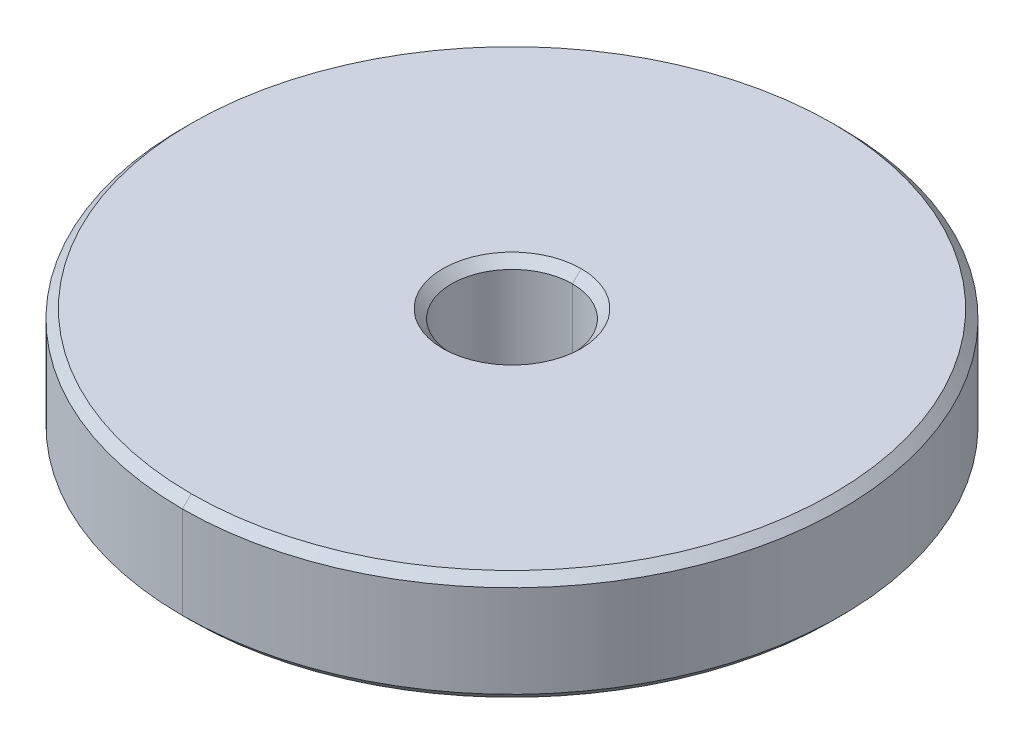
ISO-10303-21;
HEADER;
FILE_DESCRIPTION(('STEP AP214'),'2;1');
FILE_NAME('part.step','',(''),(''),'','','');
FILE_SCHEMA(('AUTOMOTIVE_DESIGN { 1 0 10303 214 1 1 1 1 }'));
ENDSEC;
DATA;
#1=APPLICATION_CONTEXT('core data for automotive mechanical design processes');
#2=APPLICATION_PROTOCOL_DEFINITION('international standard','automotive_design',2000,#1);
#3=PRODUCT_CONTEXT('',#1,'mechanical');
#4=PRODUCT('Part','Part','',(#3));
#5=PRODUCT_RELATED_PRODUCT_CATEGORY('part','',(#4));
#6=PRODUCT_DEFINITION_FORMATION('','',#4);
#7=PRODUCT_DEFINITION_CONTEXT('part definition',#1,'design');
#8=PRODUCT_DEFINITION('design','',#6,#7);
#9=PRODUCT_DEFINITION_SHAPE('','',#8);
#10=(LENGTH_UNIT() NAMED_UNIT(*) SI_UNIT(.MILLI.,.METRE.));
#11=(NAMED_UNIT(*) PLANE_ANGLE_UNIT() SI_UNIT($,.RADIAN.));
#12=(NAMED_UNIT(*) SI_UNIT($,.STERADIAN.) SOLID_ANGLE_UNIT());
#13=UNCERTAINTY_MEASURE_WITH_UNIT(LENGTH_MEASURE(1.E-05),#10,'distance_accuracy_value','');
#14=(GEOMETRIC_REPRESENTATION_CONTEXT(3) GLOBAL_UNCERTAINTY_ASSIGNED_CONTEXT((#13)) GLOBAL_UNIT_ASSIGNED_CONTEXT((#10,
#11,#12)) REPRESENTATION_CONTEXT('',''));
#15=CARTESIAN_POINT('',(0.,0.,0.));
#16=DIRECTION('',(0.,0.,1.));
#17=DIRECTION('',(1.,0.,0.));
#18=AXIS2_PLACEMENT_3D('',#15,#16,#17);
#19=CARTESIAN_POINT('',(0.,6.35,0.));
#20=DIRECTION('',(0.,-1.,0.));
#21=DIRECTION('',(0.,0.,-1.));
#22=AXIS2_PLACEMENT_3D('',#19,#20,#21);
#23=CYLINDRICAL_SURFACE('',#22,3.4925);
#24=CARTESIAN_POINT('',(0.,5.842,0.));
#25=DIRECTION('',(0.,-1.,0.));
#26=DIRECTION('',(0.,0.,-1.));
#27=AXIS2_PLACEMENT_3D('',#24,#25,#26);
#28=CIRCLE('',#27,3.4925);
#29=CARTESIAN_POINT('',(0.,5.842,-3.4925));
#30=VERTEX_POINT('',#29);
#31=CARTESIAN_POINT('',(0.,5.842,3.4925));
#32=VERTEX_POINT('',#31);
#33=EDGE_CURVE('E164',#30,#32,#28,.T.);
#34=ORIENTED_EDGE('',*,*,#33,.F.);
#35=DIRECTION('',(0.,1.,0.));
#36=VECTOR('',#35,1.);
#37=CARTESIAN_POINT('',(0.,0.507999999999995,-3.4925));
#38=LINE('',#37,#36);
#39=CARTESIAN_POINT('',(0.,0.507999999999999,-3.4925));
#40=VERTEX_POINT('',#39);
#41=EDGE_CURVE('E147',#40,#30,#38,.T.);
#42=ORIENTED_EDGE('',*,*,#41,.F.);
#43=CARTESIAN_POINT('',(0.,0.508000000000003,0.));
#44=DIRECTION('',(0.,1.,0.));
#45=DIRECTION('',(0.,0.,1.));
#46=AXIS2_PLACEMENT_3D('',#43,#44,#45);
#47=CIRCLE('',#46,3.49250000000001);
#48=CARTESIAN_POINT('',(0.,0.507999999999999,3.4925));
#49=VERTEX_POINT('',#48);
#50=EDGE_CURVE('E134',#49,#40,#47,.T.);
#51=ORIENTED_EDGE('',*,*,#50,.F.);
#52=DIRECTION('',(0.,1.,0.));
#53=VECTOR('',#52,1.);
#54=CARTESIAN_POINT('',(0.,0.507999999999995,3.4925));
#55=LINE('',#54,#53);
#56=EDGE_CURVE('E20',#49,#32,#55,.T.);
#57=ORIENTED_EDGE('',*,*,#56,.T.);
#58=EDGE_LOOP('',(#34,#42,#51,#57));
#59=FACE_BOUND('',#58,.T.);
#60=ADVANCED_FACE('F17',(#59),#23,.F.);
#61=CARTESIAN_POINT('',(0.,0.,0.));
#62=DIRECTION('',(0.,1.,0.));
#63=DIRECTION('',(0.,0.,1.));
#64=AXIS2_PLACEMENT_3D('',#61,#62,#63);
#65=PLANE('',#64);
#66=CARTESIAN_POINT('',(0.,0.,0.));
#67=DIRECTION('',(0.,1.,0.));
#68=DIRECTION('',(0.,0.,1.));
#69=AXIS2_PLACEMENT_3D('',#66,#67,#68);
#70=CIRCLE('',#69,4.00049999999999);
#71=CARTESIAN_POINT('',(0.,0.,4.0005));
#72=VERTEX_POINT('',#71);
#73=CARTESIAN_POINT('',(0.,0.,-4.0005));
#74=VERTEX_POINT('',#73);
#75=EDGE_CURVE('E33',#72,#74,#70,.T.);
#76=ORIENTED_EDGE('',*,*,#75,.T.);
#77=CARTESIAN_POINT('',(0.,0.,0.));
#78=DIRECTION('',(0.,1.,0.));
#79=DIRECTION('',(0.,0.,-1.));
#80=AXIS2_PLACEMENT_3D('',#77,#78,#79);
#81=CIRCLE('',#80,4.00049999999999);
#82=EDGE_CURVE('E36',#74,#72,#81,.T.);
#83=ORIENTED_EDGE('',*,*,#82,.T.);
#84=EDGE_LOOP('',(#76,#83));
#85=FACE_BOUND('',#84,.T.);
#86=CARTESIAN_POINT('',(0.,0.,0.));
#87=DIRECTION('',(0.,-1.,0.));
#88=DIRECTION('',(0.,0.,-1.));
#89=AXIS2_PLACEMENT_3D('',#86,#87,#88);
#90=CIRCLE('',#89,18.542);
#91=CARTESIAN_POINT('',(0.,0.,-18.542));
#92=VERTEX_POINT('',#91);
#93=CARTESIAN_POINT('',(0.,0.,18.542));
#94=VERTEX_POINT('',#93);
#95=EDGE_CURVE('E11',#92,#94,#90,.T.);
#96=ORIENTED_EDGE('',*,*,#95,.T.);
#97=CARTESIAN_POINT('',(0.,0.,0.));
#98=DIRECTION('',(0.,-1.,0.));
#99=DIRECTION('',(0.,0.,1.));
#100=AXIS2_PLACEMENT_3D('',#97,#98,#99);
#101=CIRCLE('',#100,18.542);
#102=EDGE_CURVE('E26',#94,#92,#101,.T.);
#103=ORIENTED_EDGE('',*,*,#102,.T.);
#104=EDGE_LOOP('',(#96,#103));
#105=FACE_BOUND('',#104,.T.);
#106=ADVANCED_FACE('F218',(#85,#105),#65,.F.);
#107=CARTESIAN_POINT('',(0.,-0.0460364051594053,0.));
#108=DIRECTION('',(0.,1.,0.));
#109=DIRECTION('',(0.,0.,1.));
#110=AXIS2_PLACEMENT_3D('',#107,#108,#109);
#111=CONICAL_SURFACE('',#110,18.4959635948406,0.785398163397452);
#112=DIRECTION('',(0.,-0.707106781186545,0.70710678118655));
#113=VECTOR('',#112,1.);
#114=CARTESIAN_POINT('',(0.,0.508000000000008,-19.05));
#115=LINE('',#114,#113);
#116=CARTESIAN_POINT('',(0.,0.508000000000001,-19.05));
#117=VERTEX_POINT('',#116);
#118=EDGE_CURVE('E88',#117,#92,#115,.T.);
#119=ORIENTED_EDGE('',*,*,#118,.F.);
#120=CARTESIAN_POINT('',(0.,0.508000000000019,0.));
#121=DIRECTION('',(0.,-1.,0.));
#122=DIRECTION('',(0.,0.,-1.));
#123=AXIS2_PLACEMENT_3D('',#120,#121,#122);
#124=CIRCLE('',#123,19.05);
#125=CARTESIAN_POINT('',(0.,0.508000000000001,19.05));
#126=VERTEX_POINT('',#125);
#127=EDGE_CURVE('E81',#117,#126,#124,.T.);
#128=ORIENTED_EDGE('',*,*,#127,.T.);
#129=DIRECTION('',(0.,-0.707106781186545,-0.70710678118655));
#130=VECTOR('',#129,1.);
#131=CARTESIAN_POINT('',(0.,0.508000000000008,19.05));
#132=LINE('',#131,#130);
#133=EDGE_CURVE('E85',#126,#94,#132,.T.);
#134=ORIENTED_EDGE('',*,*,#133,.T.);
#135=ORIENTED_EDGE('',*,*,#95,.F.);
#136=EDGE_LOOP('',(#119,#128,#134,#135));
#137=FACE_BOUND('',#136,.T.);
#138=ADVANCED_FACE('F83',(#137),#111,.T.);
#139=CARTESIAN_POINT('',(0.,-0.0460364051594053,0.));
#140=DIRECTION('',(0.,1.,0.));
#141=DIRECTION('',(0.,0.,1.));
#142=AXIS2_PLACEMENT_3D('',#139,#140,#141);
#143=CONICAL_SURFACE('',#142,18.4959635948406,0.785398163397452);
#144=ORIENTED_EDGE('',*,*,#102,.F.);
#145=ORIENTED_EDGE('',*,*,#133,.F.);
#146=CARTESIAN_POINT('',(0.,0.508000000000019,0.));
#147=DIRECTION('',(0.,-1.,0.));
#148=DIRECTION('',(0.,0.,1.));
#149=AXIS2_PLACEMENT_3D('',#146,#147,#148);
#150=CIRCLE('',#149,19.05);
#151=EDGE_CURVE('E100',#126,#117,#150,.T.);
#152=ORIENTED_EDGE('',*,*,#151,.T.);
#153=ORIENTED_EDGE('',*,*,#118,.T.);
#154=EDGE_LOOP('',(#144,#145,#152,#153));
#155=FACE_BOUND('',#154,.T.);
#156=ADVANCED_FACE('F99',(#155),#143,.T.);
#157=CARTESIAN_POINT('',(0.,6.35,0.));
#158=DIRECTION('',(0.,-1.,0.));
#159=DIRECTION('',(0.,0.,-1.));
#160=AXIS2_PLACEMENT_3D('',#157,#158,#159);
#161=CYLINDRICAL_SURFACE('',#160,19.05);
#162=CARTESIAN_POINT('',(0.,5.84199999999997,0.));
#163=DIRECTION('',(0.,1.,0.));
#164=DIRECTION('',(0.,0.,-1.));
#165=AXIS2_PLACEMENT_3D('',#162,#163,#164);
#166=CIRCLE('',#165,19.05);
#167=CARTESIAN_POINT('',(0.,5.84199999999999,-19.05));
#168=VERTEX_POINT('',#167);
#169=CARTESIAN_POINT('',(0.,5.84199999999999,19.05));
#170=VERTEX_POINT('',#169);
#171=EDGE_CURVE('E184',#168,#170,#166,.T.);
#172=ORIENTED_EDGE('',*,*,#171,.F.);
#173=DIRECTION('',(0.,1.,0.));
#174=VECTOR('',#173,1.);
#175=CARTESIAN_POINT('',(0.,0.507999999999993,-19.05));
#176=LINE('',#175,#174);
#177=EDGE_CURVE('E95',#117,#168,#176,.T.);
#178=ORIENTED_EDGE('',*,*,#177,.F.);
#179=ORIENTED_EDGE('',*,*,#151,.F.);
#180=DIRECTION('',(0.,1.,0.));
#181=VECTOR('',#180,1.);
#182=CARTESIAN_POINT('',(0.,0.507999999999993,19.05));
#183=LINE('',#182,#181);
#184=EDGE_CURVE('E94',#126,#170,#183,.T.);
#185=ORIENTED_EDGE('',*,*,#184,.T.);
#186=EDGE_LOOP('',(#172,#178,#179,#185));
#187=FACE_BOUND('',#186,.T.);
#188=ADVANCED_FACE('F105',(#187),#161,.T.);
#189=CARTESIAN_POINT('',(0.,6.35,0.));
#190=DIRECTION('',(0.,-1.,0.));
#191=DIRECTION('',(0.,0.,-1.));
#192=AXIS2_PLACEMENT_3D('',#189,#190,#191);
#193=CYLINDRICAL_SURFACE('',#192,19.05);
#194=ORIENTED_EDGE('',*,*,#184,.F.);
#195=ORIENTED_EDGE('',*,*,#127,.F.);
#196=ORIENTED_EDGE('',*,*,#177,.T.);
#197=CARTESIAN_POINT('',(0.,5.84199999999999,0.));
#198=DIRECTION('',(0.,1.,0.));
#199=DIRECTION('',(0.,0.,1.));
#200=AXIS2_PLACEMENT_3D('',#197,#198,#199);
#201=CIRCLE('',#200,19.05);
#202=EDGE_CURVE('E111',#170,#168,#201,.T.);
#203=ORIENTED_EDGE('',*,*,#202,.F.);
#204=EDGE_LOOP('',(#194,#195,#196,#203));
#205=FACE_BOUND('',#204,.T.);
#206=ADVANCED_FACE('F109',(#205),#193,.T.);
#207=CARTESIAN_POINT('',(0.,6.39603640515942,0.));
#208=DIRECTION('',(0.,-1.,0.));
#209=DIRECTION('',(0.,0.,-1.));
#210=AXIS2_PLACEMENT_3D('',#207,#208,#209);
#211=CONICAL_SURFACE('',#210,18.4959635948406,0.785398163397445);
#212=DIRECTION('',(0.,0.70710678118655,-0.707106781186545));
#213=VECTOR('',#212,1.);
#214=CARTESIAN_POINT('',(0.,5.84199999999998,19.05));
#215=LINE('',#214,#213);
#216=CARTESIAN_POINT('',(0.,6.35000000000001,18.542));
#217=VERTEX_POINT('',#216);
#218=EDGE_CURVE('E176',#170,#217,#215,.T.);
#219=ORIENTED_EDGE('',*,*,#218,.F.);
#220=ORIENTED_EDGE('',*,*,#202,.T.);
#221=DIRECTION('',(0.,0.70710678118655,0.707106781186545));
#222=VECTOR('',#221,1.);
#223=CARTESIAN_POINT('',(0.,5.84199999999998,-19.05));
#224=LINE('',#223,#222);
#225=CARTESIAN_POINT('',(0.,6.35000000000001,-18.542));
#226=VERTEX_POINT('',#225);
#227=EDGE_CURVE('E188',#168,#226,#224,.T.);
#228=ORIENTED_EDGE('',*,*,#227,.T.);
#229=CARTESIAN_POINT('',(0.,6.35000000000002,0.));
#230=DIRECTION('',(0.,1.,0.));
#231=DIRECTION('',(0.,0.,1.));
#232=AXIS2_PLACEMENT_3D('',#229,#230,#231);
#233=CIRCLE('',#232,18.542);
#234=EDGE_CURVE('E172',#217,#226,#233,.T.);
#235=ORIENTED_EDGE('',*,*,#234,.F.);
#236=EDGE_LOOP('',(#219,#220,#228,#235));
#237=FACE_BOUND('',#236,.T.);
#238=ADVANCED_FACE('F199',(#237),#211,.T.);
#239=CARTESIAN_POINT('',(0.,6.39603640515942,0.));
#240=DIRECTION('',(0.,-1.,0.));
#241=DIRECTION('',(0.,0.,-1.));
#242=AXIS2_PLACEMENT_3D('',#239,#240,#241);
#243=CONICAL_SURFACE('',#242,18.4959635948406,0.785398163397445);
#244=CARTESIAN_POINT('',(0.,6.35000000000002,0.));
#245=DIRECTION('',(0.,1.,0.));
#246=DIRECTION('',(0.,0.,-1.));
#247=AXIS2_PLACEMENT_3D('',#244,#245,#246);
#248=CIRCLE('',#247,18.542);
#249=EDGE_CURVE('E168',#226,#217,#248,.T.);
#250=ORIENTED_EDGE('',*,*,#249,.F.);
#251=ORIENTED_EDGE('',*,*,#227,.F.);
#252=ORIENTED_EDGE('',*,*,#171,.T.);
#253=ORIENTED_EDGE('',*,*,#218,.T.);
#254=EDGE_LOOP('',(#250,#251,#252,#253));
#255=FACE_BOUND('',#254,.T.);
#256=ADVANCED_FACE('F202',(#255),#243,.T.);
#257=CARTESIAN_POINT('',(0.,6.35,0.));
#258=DIRECTION('',(0.,1.,0.));
#259=DIRECTION('',(0.,0.,1.));
#260=AXIS2_PLACEMENT_3D('',#257,#258,#259);
#261=PLANE('',#260);
#262=CARTESIAN_POINT('',(0.,6.35,0.));
#263=DIRECTION('',(0.,-1.,0.));
#264=DIRECTION('',(0.,0.,-1.));
#265=AXIS2_PLACEMENT_3D('',#262,#263,#264);
#266=CIRCLE('',#265,4.0005);
#267=CARTESIAN_POINT('',(0.,6.35,-4.0005));
#268=VERTEX_POINT('',#267);
#269=CARTESIAN_POINT('',(0.,6.35,4.0005));
#270=VERTEX_POINT('',#269);
#271=EDGE_CURVE('E163',#268,#270,#266,.T.);
#272=ORIENTED_EDGE('',*,*,#271,.T.);
#273=CARTESIAN_POINT('',(0.,6.35,0.));
#274=DIRECTION('',(0.,-1.,0.));
#275=DIRECTION('',(0.,0.,1.));
#276=AXIS2_PLACEMENT_3D('',#273,#274,#275);
#277=CIRCLE('',#276,4.0005);
#278=EDGE_CURVE('E158',#270,#268,#277,.T.);
#279=ORIENTED_EDGE('',*,*,#278,.T.);
#280=EDGE_LOOP('',(#272,#279));
#281=FACE_BOUND('',#280,.T.);
#282=ORIENTED_EDGE('',*,*,#234,.T.);
#283=ORIENTED_EDGE('',*,*,#249,.T.);
#284=EDGE_LOOP('',(#282,#283));
#285=FACE_BOUND('',#284,.T.);
#286=ADVANCED_FACE('F204',(#281,#285),#261,.T.);
#287=CARTESIAN_POINT('',(0.,5.7959635948406,0.));
#288=DIRECTION('',(0.,1.,0.));
#289=DIRECTION('',(0.,0.,1.));
#290=AXIS2_PLACEMENT_3D('',#287,#288,#289);
#291=CONICAL_SURFACE('',#290,3.4464635948406,0.78539816339745);
#292=ORIENTED_EDGE('',*,*,#33,.T.);
#293=DIRECTION('',(0.,-0.707106781186547,-0.707106781186548));
#294=VECTOR('',#293,1.);
#295=CARTESIAN_POINT('',(0.,6.35,4.0005));
#296=LINE('',#295,#294);
#297=EDGE_CURVE('E154',#270,#32,#296,.T.);
#298=ORIENTED_EDGE('',*,*,#297,.F.);
#299=ORIENTED_EDGE('',*,*,#271,.F.);
#300=DIRECTION('',(0.,-0.707106781186547,0.707106781186548));
#301=VECTOR('',#300,1.);
#302=CARTESIAN_POINT('',(0.,6.35,-4.0005));
#303=LINE('',#302,#301);
#304=EDGE_CURVE('E159',#268,#30,#303,.T.);
#305=ORIENTED_EDGE('',*,*,#304,.T.);
#306=EDGE_LOOP('',(#292,#298,#299,#305));
#307=FACE_BOUND('',#306,.T.);
#308=ADVANCED_FACE('F206',(#307),#291,.F.);
#309=CARTESIAN_POINT('',(0.,5.7959635948406,0.));
#310=DIRECTION('',(0.,1.,0.));
#311=DIRECTION('',(0.,0.,1.));
#312=AXIS2_PLACEMENT_3D('',#309,#310,#311);
#313=CONICAL_SURFACE('',#312,3.4464635948406,0.78539816339745);
#314=ORIENTED_EDGE('',*,*,#304,.F.);
#315=ORIENTED_EDGE('',*,*,#278,.F.);
#316=ORIENTED_EDGE('',*,*,#297,.T.);
#317=CARTESIAN_POINT('',(0.,5.842,0.));
#318=DIRECTION('',(0.,-1.,0.));
#319=DIRECTION('',(0.,0.,1.));
#320=AXIS2_PLACEMENT_3D('',#317,#318,#319);
#321=CIRCLE('',#320,3.4925);
#322=EDGE_CURVE('E125',#32,#30,#321,.T.);
#323=ORIENTED_EDGE('',*,*,#322,.T.);
#324=EDGE_LOOP('',(#314,#315,#316,#323));
#325=FACE_BOUND('',#324,.T.);
#326=ADVANCED_FACE('F213',(#325),#313,.F.);
#327=CARTESIAN_POINT('',(0.,6.35,0.));
#328=DIRECTION('',(0.,-1.,0.));
#329=DIRECTION('',(0.,0.,-1.));
#330=AXIS2_PLACEMENT_3D('',#327,#328,#329);
#331=CYLINDRICAL_SURFACE('',#330,3.4925);
#332=ORIENTED_EDGE('',*,*,#56,.F.);
#333=CARTESIAN_POINT('',(0.,0.508000000000003,0.));
#334=DIRECTION('',(0.,1.,0.));
#335=DIRECTION('',(0.,0.,-1.));
#336=AXIS2_PLACEMENT_3D('',#333,#334,#335);
#337=CIRCLE('',#336,3.49250000000001);
#338=EDGE_CURVE('E126',#40,#49,#337,.T.);
#339=ORIENTED_EDGE('',*,*,#338,.F.);
#340=ORIENTED_EDGE('',*,*,#41,.T.);
#341=ORIENTED_EDGE('',*,*,#322,.F.);
#342=EDGE_LOOP('',(#332,#339,#340,#341));
#343=FACE_BOUND('',#342,.T.);
#344=ADVANCED_FACE('F232',(#343),#331,.F.);
#345=CARTESIAN_POINT('',(0.,0.554036405159399,0.));
#346=DIRECTION('',(0.,-1.,0.));
#347=DIRECTION('',(0.,0.,-1.));
#348=AXIS2_PLACEMENT_3D('',#345,#346,#347);
#349=CONICAL_SURFACE('',#348,3.44646359484061,0.785398163397441);
#350=DIRECTION('',(0.,0.707106781186553,-0.707106781186542));
#351=VECTOR('',#350,1.);
#352=CARTESIAN_POINT('',(0.,0.,4.0005));
#353=LINE('',#352,#351);
#354=EDGE_CURVE('E129',#72,#49,#353,.T.);
#355=ORIENTED_EDGE('',*,*,#354,.F.);
#356=ORIENTED_EDGE('',*,*,#82,.F.);
#357=DIRECTION('',(0.,0.707106781186553,0.707106781186542));
#358=VECTOR('',#357,1.);
#359=CARTESIAN_POINT('',(0.,0.,-4.0005));
#360=LINE('',#359,#358);
#361=EDGE_CURVE('E128',#74,#40,#360,.T.);
#362=ORIENTED_EDGE('',*,*,#361,.T.);
#363=ORIENTED_EDGE('',*,*,#338,.T.);
#364=EDGE_LOOP('',(#355,#356,#362,#363));
#365=FACE_BOUND('',#364,.T.);
#366=ADVANCED_FACE('F235',(#365),#349,.F.);
#367=CARTESIAN_POINT('',(0.,0.554036405159399,0.));
#368=DIRECTION('',(0.,-1.,0.));
#369=DIRECTION('',(0.,0.,-1.));
#370=AXIS2_PLACEMENT_3D('',#367,#368,#369);
#371=CONICAL_SURFACE('',#370,3.44646359484061,0.785398163397441);
#372=ORIENTED_EDGE('',*,*,#50,.T.);
#373=ORIENTED_EDGE('',*,*,#361,.F.);
#374=ORIENTED_EDGE('',*,*,#75,.F.);
#375=ORIENTED_EDGE('',*,*,#354,.T.);
#376=EDGE_LOOP('',(#372,#373,#374,#375));
#377=FACE_BOUND('',#376,.T.);
#378=ADVANCED_FACE('F236',(#377),#371,.F.);
#379=CLOSED_SHELL('',(#60,#106,#138,#156,#188,#206,#238,#256,#286,#308,#326,#344,#366,#378));
#380=MANIFOLD_SOLID_BREP('B1',#379);
#381=ADVANCED_BREP_SHAPE_REPRESENTATION('',(#18,#380),#14);
#382=SHAPE_DEFINITION_REPRESENTATION(#9,#381);
ENDSEC;
END-ISO-10303-21;
